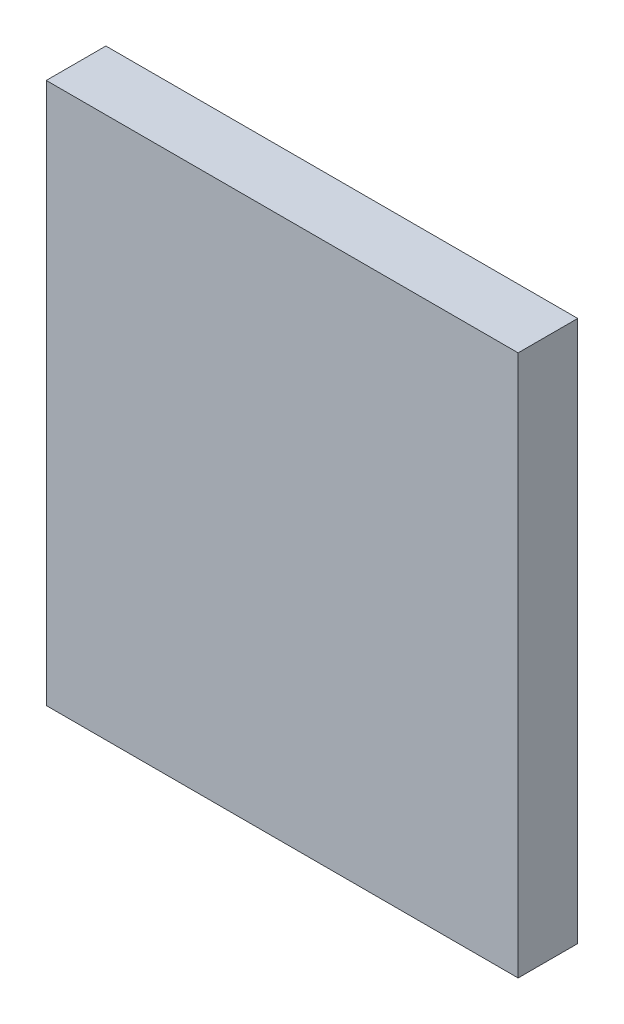
ISO-10303-21;
HEADER;
FILE_DESCRIPTION(('STEP AP214'),'2;1');
FILE_NAME('part.step','',(''),(''),'','','');
FILE_SCHEMA(('AUTOMOTIVE_DESIGN { 1 0 10303 214 1 1 1 1 }'));
ENDSEC;
DATA;
#1=APPLICATION_CONTEXT('core data for automotive mechanical design processes');
#2=APPLICATION_PROTOCOL_DEFINITION('international standard','automotive_design',2000,#1);
#3=PRODUCT_CONTEXT('',#1,'mechanical');
#4=PRODUCT('Part','Part','',(#3));
#5=PRODUCT_RELATED_PRODUCT_CATEGORY('part','',(#4));
#6=PRODUCT_DEFINITION_FORMATION('','',#4);
#7=PRODUCT_DEFINITION_CONTEXT('part definition',#1,'design');
#8=PRODUCT_DEFINITION('design','',#6,#7);
#9=PRODUCT_DEFINITION_SHAPE('','',#8);
#10=(LENGTH_UNIT() NAMED_UNIT(*) SI_UNIT(.MILLI.,.METRE.));
#11=(NAMED_UNIT(*) PLANE_ANGLE_UNIT() SI_UNIT($,.RADIAN.));
#12=(NAMED_UNIT(*) SI_UNIT($,.STERADIAN.) SOLID_ANGLE_UNIT());
#13=UNCERTAINTY_MEASURE_WITH_UNIT(LENGTH_MEASURE(1.E-05),#10,'distance_accuracy_value','');
#14=(GEOMETRIC_REPRESENTATION_CONTEXT(3) GLOBAL_UNCERTAINTY_ASSIGNED_CONTEXT((#13)) GLOBAL_UNIT_ASSIGNED_CONTEXT((#10,
#11,#12)) REPRESENTATION_CONTEXT('',''));
#15=CARTESIAN_POINT('',(0.,0.,0.));
#16=DIRECTION('',(0.,0.,1.));
#17=DIRECTION('',(1.,0.,0.));
#18=AXIS2_PLACEMENT_3D('',#15,#16,#17);
#19=CARTESIAN_POINT('',(0.,0.,0.8));
#20=DIRECTION('',(0.,0.,1.));
#21=DIRECTION('',(1.,0.,0.));
#22=AXIS2_PLACEMENT_3D('',#19,#20,#21);
#23=PLANE('',#22);
#24=DIRECTION('',(0.,1.,0.));
#25=VECTOR('',#24,1.);
#26=CARTESIAN_POINT('',(4.75,-7.3,0.8));
#27=LINE('',#26,#25);
#28=CARTESIAN_POINT('',(4.75,-7.3,0.8));
#29=VERTEX_POINT('',#28);
#30=CARTESIAN_POINT('',(4.75,3.6,0.8));
#31=VERTEX_POINT('',#30);
#32=EDGE_CURVE('E55',#29,#31,#27,.T.);
#33=ORIENTED_EDGE('',*,*,#32,.F.);
#34=DIRECTION('',(1.,0.,0.));
#35=VECTOR('',#34,1.);
#36=CARTESIAN_POINT('',(-4.75,-7.3,0.8));
#37=LINE('',#36,#35);
#38=CARTESIAN_POINT('',(-4.75,-7.3,0.8));
#39=VERTEX_POINT('',#38);
#40=EDGE_CURVE('E57',#39,#29,#37,.T.);
#41=ORIENTED_EDGE('',*,*,#40,.F.);
#42=DIRECTION('',(0.,-1.,0.));
#43=VECTOR('',#42,1.);
#44=CARTESIAN_POINT('',(-4.75,3.6,0.8));
#45=LINE('',#44,#43);
#46=CARTESIAN_POINT('',(-4.75,3.6,0.8));
#47=VERTEX_POINT('',#46);
#48=EDGE_CURVE('E20',#47,#39,#45,.T.);
#49=ORIENTED_EDGE('',*,*,#48,.F.);
#50=DIRECTION('',(-1.,0.,0.));
#51=VECTOR('',#50,1.);
#52=CARTESIAN_POINT('',(4.75,3.6,0.8));
#53=LINE('',#52,#51);
#54=EDGE_CURVE('E79',#31,#47,#53,.T.);
#55=ORIENTED_EDGE('',*,*,#54,.F.);
#56=EDGE_LOOP('',(#33,#41,#49,#55));
#57=FACE_BOUND('',#56,.T.);
#58=ADVANCED_FACE('F17',(#57),#23,.F.);
#59=CARTESIAN_POINT('',(-4.75,3.6,0.8));
#60=DIRECTION('',(-1.,0.,0.));
#61=DIRECTION('',(0.,-1.,0.));
#62=AXIS2_PLACEMENT_3D('',#59,#60,#61);
#63=PLANE('',#62);
#64=DIRECTION('',(0.,1.,0.));
#65=VECTOR('',#64,1.);
#66=CARTESIAN_POINT('',(-4.75,0.,2.));
#67=LINE('',#66,#65);
#68=CARTESIAN_POINT('',(-4.75,3.6,2.));
#69=VERTEX_POINT('',#68);
#70=CARTESIAN_POINT('',(-4.75,-7.3,2.));
#71=VERTEX_POINT('',#70);
#72=EDGE_CURVE('E83',#69,#71,#67,.F.);
#73=ORIENTED_EDGE('',*,*,#72,.F.);
#74=DIRECTION('',(0.,0.,1.));
#75=VECTOR('',#74,1.);
#76=CARTESIAN_POINT('',(-4.75,3.6,0.8));
#77=LINE('',#76,#75);
#78=EDGE_CURVE('E68',#47,#69,#77,.T.);
#79=ORIENTED_EDGE('',*,*,#78,.F.);
#80=ORIENTED_EDGE('',*,*,#48,.T.);
#81=DIRECTION('',(0.,0.,1.));
#82=VECTOR('',#81,1.);
#83=CARTESIAN_POINT('',(-4.75,-7.3,0.8));
#84=LINE('',#83,#82);
#85=EDGE_CURVE('E63',#71,#39,#84,.F.);
#86=ORIENTED_EDGE('',*,*,#85,.F.);
#87=EDGE_LOOP('',(#73,#79,#80,#86));
#88=FACE_BOUND('',#87,.T.);
#89=ADVANCED_FACE('F65',(#88),#63,.T.);
#90=CARTESIAN_POINT('',(-4.75,-7.3,0.8));
#91=DIRECTION('',(0.,-1.,0.));
#92=DIRECTION('',(1.,0.,0.));
#93=AXIS2_PLACEMENT_3D('',#90,#91,#92);
#94=PLANE('',#93);
#95=DIRECTION('',(1.,0.,0.));
#96=VECTOR('',#95,1.);
#97=CARTESIAN_POINT('',(0.,-7.3,2.));
#98=LINE('',#97,#96);
#99=CARTESIAN_POINT('',(4.75,-7.3,2.));
#100=VERTEX_POINT('',#99);
#101=EDGE_CURVE('E72',#71,#100,#98,.T.);
#102=ORIENTED_EDGE('',*,*,#101,.F.);
#103=ORIENTED_EDGE('',*,*,#85,.T.);
#104=ORIENTED_EDGE('',*,*,#40,.T.);
#105=DIRECTION('',(0.,0.,1.));
#106=VECTOR('',#105,1.);
#107=CARTESIAN_POINT('',(4.75,-7.3,0.8));
#108=LINE('',#107,#106);
#109=EDGE_CURVE('E75',#100,#29,#108,.F.);
#110=ORIENTED_EDGE('',*,*,#109,.F.);
#111=EDGE_LOOP('',(#102,#103,#104,#110));
#112=FACE_BOUND('',#111,.T.);
#113=ADVANCED_FACE('F70',(#112),#94,.T.);
#114=CARTESIAN_POINT('',(4.75,-7.3,0.8));
#115=DIRECTION('',(1.,0.,0.));
#116=DIRECTION('',(0.,1.,0.));
#117=AXIS2_PLACEMENT_3D('',#114,#115,#116);
#118=PLANE('',#117);
#119=DIRECTION('',(0.,1.,0.));
#120=VECTOR('',#119,1.);
#121=CARTESIAN_POINT('',(4.75,0.,2.));
#122=LINE('',#121,#120);
#123=CARTESIAN_POINT('',(4.75,3.6,2.));
#124=VERTEX_POINT('',#123);
#125=EDGE_CURVE('E26',#100,#124,#122,.T.);
#126=ORIENTED_EDGE('',*,*,#125,.F.);
#127=ORIENTED_EDGE('',*,*,#109,.T.);
#128=ORIENTED_EDGE('',*,*,#32,.T.);
#129=DIRECTION('',(0.,0.,1.));
#130=VECTOR('',#129,1.);
#131=CARTESIAN_POINT('',(4.75,3.6,0.8));
#132=LINE('',#131,#130);
#133=EDGE_CURVE('E35',#124,#31,#132,.F.);
#134=ORIENTED_EDGE('',*,*,#133,.F.);
#135=EDGE_LOOP('',(#126,#127,#128,#134));
#136=FACE_BOUND('',#135,.T.);
#137=ADVANCED_FACE('F89',(#136),#118,.T.);
#138=CARTESIAN_POINT('',(4.75,3.6,0.8));
#139=DIRECTION('',(0.,1.,0.));
#140=DIRECTION('',(-1.,0.,0.));
#141=AXIS2_PLACEMENT_3D('',#138,#139,#140);
#142=PLANE('',#141);
#143=DIRECTION('',(1.,0.,0.));
#144=VECTOR('',#143,1.);
#145=CARTESIAN_POINT('',(0.,3.6,2.));
#146=LINE('',#145,#144);
#147=EDGE_CURVE('E11',#124,#69,#146,.F.);
#148=ORIENTED_EDGE('',*,*,#147,.F.);
#149=ORIENTED_EDGE('',*,*,#133,.T.);
#150=ORIENTED_EDGE('',*,*,#54,.T.);
#151=ORIENTED_EDGE('',*,*,#78,.T.);
#152=EDGE_LOOP('',(#148,#149,#150,#151));
#153=FACE_BOUND('',#152,.T.);
#154=ADVANCED_FACE('F91',(#153),#142,.T.);
#155=CARTESIAN_POINT('',(0.,0.,2.));
#156=DIRECTION('',(0.,0.,1.));
#157=DIRECTION('',(1.,0.,0.));
#158=AXIS2_PLACEMENT_3D('',#155,#156,#157);
#159=PLANE('',#158);
#160=ORIENTED_EDGE('',*,*,#125,.T.);
#161=ORIENTED_EDGE('',*,*,#147,.T.);
#162=ORIENTED_EDGE('',*,*,#72,.T.);
#163=ORIENTED_EDGE('',*,*,#101,.T.);
#164=EDGE_LOOP('',(#160,#161,#162,#163));
#165=FACE_BOUND('',#164,.T.);
#166=ADVANCED_FACE('F88',(#165),#159,.T.);
#167=CLOSED_SHELL('',(#58,#89,#113,#137,#154,#166));
#168=MANIFOLD_SOLID_BREP('B1',#167);
#169=ADVANCED_BREP_SHAPE_REPRESENTATION('',(#18,#168),#14);
#170=SHAPE_DEFINITION_REPRESENTATION(#9,#169);
ENDSEC;
END-ISO-10303-21;
